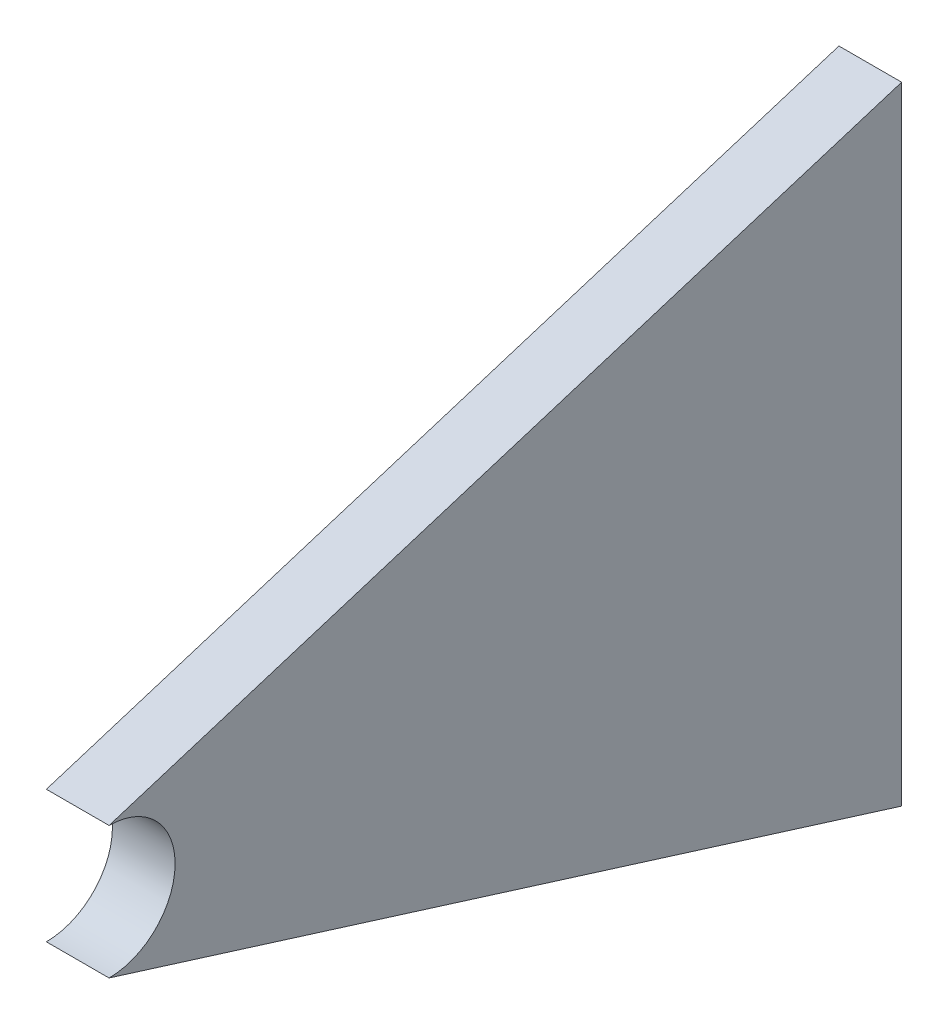
ISO-10303-21;
HEADER;
FILE_DESCRIPTION(('STEP AP214'),'2;1');
FILE_NAME('part.step','',(''),(''),'','','');
FILE_SCHEMA(('AUTOMOTIVE_DESIGN { 1 0 10303 214 1 1 1 1 }'));
ENDSEC;
DATA;
#1=APPLICATION_CONTEXT('core data for automotive mechanical design processes');
#2=APPLICATION_PROTOCOL_DEFINITION('international standard','automotive_design',2000,#1);
#3=PRODUCT_CONTEXT('',#1,'mechanical');
#4=PRODUCT('Part','Part','',(#3));
#5=PRODUCT_RELATED_PRODUCT_CATEGORY('part','',(#4));
#6=PRODUCT_DEFINITION_FORMATION('','',#4);
#7=PRODUCT_DEFINITION_CONTEXT('part definition',#1,'design');
#8=PRODUCT_DEFINITION('design','',#6,#7);
#9=PRODUCT_DEFINITION_SHAPE('','',#8);
#10=(LENGTH_UNIT() NAMED_UNIT(*) SI_UNIT(.MILLI.,.METRE.));
#11=(NAMED_UNIT(*) PLANE_ANGLE_UNIT() SI_UNIT($,.RADIAN.));
#12=(NAMED_UNIT(*) SI_UNIT($,.STERADIAN.) SOLID_ANGLE_UNIT());
#13=UNCERTAINTY_MEASURE_WITH_UNIT(LENGTH_MEASURE(1.E-05),#10,'distance_accuracy_value','');
#14=(GEOMETRIC_REPRESENTATION_CONTEXT(3) GLOBAL_UNCERTAINTY_ASSIGNED_CONTEXT((#13)) GLOBAL_UNIT_ASSIGNED_CONTEXT((#10,
#11,#12)) REPRESENTATION_CONTEXT('',''));
#15=CARTESIAN_POINT('',(0.,0.,0.));
#16=DIRECTION('',(0.,0.,1.));
#17=DIRECTION('',(1.,0.,0.));
#18=AXIS2_PLACEMENT_3D('',#15,#16,#17);
#19=CARTESIAN_POINT('',(10.,0.,99.6937226218335));
#20=DIRECTION('',(-1.,0.,0.));
#21=DIRECTION('',(0.,0.,1.));
#22=AXIS2_PLACEMENT_3D('',#19,#20,#21);
#23=CYLINDRICAL_SURFACE('',#22,10.5349261761626);
#24=CARTESIAN_POINT('',(0.,0.,99.6937226218335));
#25=DIRECTION('',(1.,0.,0.));
#26=DIRECTION('',(0.,0.,-1.));
#27=AXIS2_PLACEMENT_3D('',#24,#25,#26);
#28=CIRCLE('',#27,10.5349261761626);
#29=CARTESIAN_POINT('',(0.,-10.5349261761626,99.6937226218335));
#30=VERTEX_POINT('',#29);
#31=CARTESIAN_POINT('',(0.,10.5349261761626,99.6937226218335));
#32=VERTEX_POINT('',#31);
#33=EDGE_CURVE('E116',#30,#32,#28,.T.);
#34=ORIENTED_EDGE('',*,*,#33,.F.);
#35=DIRECTION('',(-1.,0.,0.));
#36=VECTOR('',#35,1.);
#37=CARTESIAN_POINT('',(10.,-10.5349261761626,99.6937226218335));
#38=LINE('',#37,#36);
#39=CARTESIAN_POINT('',(10.,-10.5349261761626,99.6937226218335));
#40=VERTEX_POINT('',#39);
#41=EDGE_CURVE('E11',#40,#30,#38,.T.);
#42=ORIENTED_EDGE('',*,*,#41,.F.);
#43=CARTESIAN_POINT('',(10.,0.,99.6937226218335));
#44=DIRECTION('',(1.,0.,0.));
#45=DIRECTION('',(0.,0.,-1.));
#46=AXIS2_PLACEMENT_3D('',#43,#44,#45);
#47=CIRCLE('',#46,10.5349261761626);
#48=CARTESIAN_POINT('',(10.,10.5349261761626,99.6937226218335));
#49=VERTEX_POINT('',#48);
#50=EDGE_CURVE('E108',#40,#49,#47,.T.);
#51=ORIENTED_EDGE('',*,*,#50,.T.);
#52=DIRECTION('',(-1.,0.,0.));
#53=VECTOR('',#52,1.);
#54=CARTESIAN_POINT('',(10.,10.5349261761626,99.6937226218335));
#55=LINE('',#54,#53);
#56=EDGE_CURVE('E48',#49,#32,#55,.T.);
#57=ORIENTED_EDGE('',*,*,#56,.T.);
#58=EDGE_LOOP('',(#34,#42,#51,#57));
#59=FACE_BOUND('',#58,.T.);
#60=ADVANCED_FACE('F45',(#59),#23,.F.);
#61=CARTESIAN_POINT('',(10.,-10.5349261761626,99.6937226218335));
#62=DIRECTION('',(0.,0.954567857848018,-0.297993632085396));
#63=DIRECTION('',(0.,0.297993632085396,0.954567857848018));
#64=AXIS2_PLACEMENT_3D('',#61,#62,#63);
#65=PLANE('',#64);
#66=DIRECTION('',(0.,-0.297993632085396,-0.954567857848018));
#67=VECTOR('',#66,1.);
#68=CARTESIAN_POINT('',(0.,-10.5349261761626,99.6937226218335));
#69=LINE('',#68,#67);
#70=CARTESIAN_POINT('',(0.,-50.,-26.7253914921175));
#71=VERTEX_POINT('',#70);
#72=EDGE_CURVE('E111',#30,#71,#69,.T.);
#73=ORIENTED_EDGE('',*,*,#72,.T.);
#74=DIRECTION('',(-1.,0.,0.));
#75=VECTOR('',#74,1.);
#76=CARTESIAN_POINT('',(10.,-50.,-26.7253914921175));
#77=LINE('',#76,#75);
#78=CARTESIAN_POINT('',(10.,-50.,-26.7253914921175));
#79=VERTEX_POINT('',#78);
#80=EDGE_CURVE('E55',#79,#71,#77,.T.);
#81=ORIENTED_EDGE('',*,*,#80,.F.);
#82=DIRECTION('',(0.,-0.297993632085396,-0.954567857848018));
#83=VECTOR('',#82,1.);
#84=CARTESIAN_POINT('',(10.,-10.5349261761626,99.6937226218335));
#85=LINE('',#84,#83);
#86=EDGE_CURVE('E103',#40,#79,#85,.T.);
#87=ORIENTED_EDGE('',*,*,#86,.F.);
#88=ORIENTED_EDGE('',*,*,#41,.T.);
#89=EDGE_LOOP('',(#73,#81,#87,#88));
#90=FACE_BOUND('',#89,.T.);
#91=ADVANCED_FACE('F131',(#90),#65,.F.);
#92=CARTESIAN_POINT('',(10.,50.,-26.7253914921174));
#93=DIRECTION('',(0.,0.,-1.));
#94=DIRECTION('',(0.,1.,0.));
#95=AXIS2_PLACEMENT_3D('',#92,#93,#94);
#96=PLANE('',#95);
#97=DIRECTION('',(0.,-1.,0.));
#98=VECTOR('',#97,1.);
#99=CARTESIAN_POINT('',(0.,50.,-26.7253914921174));
#100=LINE('',#99,#98);
#101=CARTESIAN_POINT('',(0.,50.,-26.7253914921174));
#102=VERTEX_POINT('',#101);
#103=EDGE_CURVE('E96',#102,#71,#100,.T.);
#104=ORIENTED_EDGE('',*,*,#103,.F.);
#105=DIRECTION('',(-1.,0.,0.));
#106=VECTOR('',#105,1.);
#107=CARTESIAN_POINT('',(10.,50.,-26.7253914921174));
#108=LINE('',#107,#106);
#109=CARTESIAN_POINT('',(10.,50.,-26.7253914921174));
#110=VERTEX_POINT('',#109);
#111=EDGE_CURVE('E91',#110,#102,#108,.T.);
#112=ORIENTED_EDGE('',*,*,#111,.F.);
#113=DIRECTION('',(0.,-1.,0.));
#114=VECTOR('',#113,1.);
#115=CARTESIAN_POINT('',(10.,50.,-26.7253914921174));
#116=LINE('',#115,#114);
#117=EDGE_CURVE('E94',#110,#79,#116,.T.);
#118=ORIENTED_EDGE('',*,*,#117,.T.);
#119=ORIENTED_EDGE('',*,*,#80,.T.);
#120=EDGE_LOOP('',(#104,#112,#118,#119));
#121=FACE_BOUND('',#120,.T.);
#122=ADVANCED_FACE('F93',(#121),#96,.T.);
#123=CARTESIAN_POINT('',(10.,10.5349261761626,99.6937226218335));
#124=DIRECTION('',(0.,0.954567857848018,0.297993632085396));
#125=DIRECTION('',(0.,-0.297993632085396,0.954567857848018));
#126=AXIS2_PLACEMENT_3D('',#123,#124,#125);
#127=PLANE('',#126);
#128=DIRECTION('',(0.,0.297993632085396,-0.954567857848018));
#129=VECTOR('',#128,1.);
#130=CARTESIAN_POINT('',(0.,10.5349261761626,99.6937226218335));
#131=LINE('',#130,#129);
#132=EDGE_CURVE('E120',#32,#102,#131,.T.);
#133=ORIENTED_EDGE('',*,*,#132,.F.);
#134=ORIENTED_EDGE('',*,*,#56,.F.);
#135=DIRECTION('',(0.,0.297993632085396,-0.954567857848018));
#136=VECTOR('',#135,1.);
#137=CARTESIAN_POINT('',(10.,10.5349261761626,99.6937226218335));
#138=LINE('',#137,#136);
#139=EDGE_CURVE('E102',#49,#110,#138,.T.);
#140=ORIENTED_EDGE('',*,*,#139,.T.);
#141=ORIENTED_EDGE('',*,*,#111,.T.);
#142=EDGE_LOOP('',(#133,#134,#140,#141));
#143=FACE_BOUND('',#142,.T.);
#144=ADVANCED_FACE('F106',(#143),#127,.T.);
#145=CARTESIAN_POINT('',(10.,0.,99.6937226218335));
#146=DIRECTION('',(1.,0.,0.));
#147=DIRECTION('',(0.,0.,-1.));
#148=AXIS2_PLACEMENT_3D('',#145,#146,#147);
#149=PLANE('',#148);
#150=ORIENTED_EDGE('',*,*,#50,.F.);
#151=ORIENTED_EDGE('',*,*,#86,.T.);
#152=ORIENTED_EDGE('',*,*,#117,.F.);
#153=ORIENTED_EDGE('',*,*,#139,.F.);
#154=EDGE_LOOP('',(#150,#151,#152,#153));
#155=FACE_BOUND('',#154,.T.);
#156=ADVANCED_FACE('F101',(#155),#149,.T.);
#157=CARTESIAN_POINT('',(0.,0.,99.6937226218335));
#158=DIRECTION('',(1.,0.,0.));
#159=DIRECTION('',(0.,0.,-1.));
#160=AXIS2_PLACEMENT_3D('',#157,#158,#159);
#161=PLANE('',#160);
#162=ORIENTED_EDGE('',*,*,#33,.T.);
#163=ORIENTED_EDGE('',*,*,#132,.T.);
#164=ORIENTED_EDGE('',*,*,#103,.T.);
#165=ORIENTED_EDGE('',*,*,#72,.F.);
#166=EDGE_LOOP('',(#162,#163,#164,#165));
#167=FACE_BOUND('',#166,.T.);
#168=ADVANCED_FACE('F130',(#167),#161,.F.);
#169=CLOSED_SHELL('',(#60,#91,#122,#144,#156,#168));
#170=MANIFOLD_SOLID_BREP('B2',#169);
#171=ADVANCED_BREP_SHAPE_REPRESENTATION('',(#18,#170),#14);
#172=SHAPE_DEFINITION_REPRESENTATION(#9,#171);
ENDSEC;
END-ISO-10303-21;
